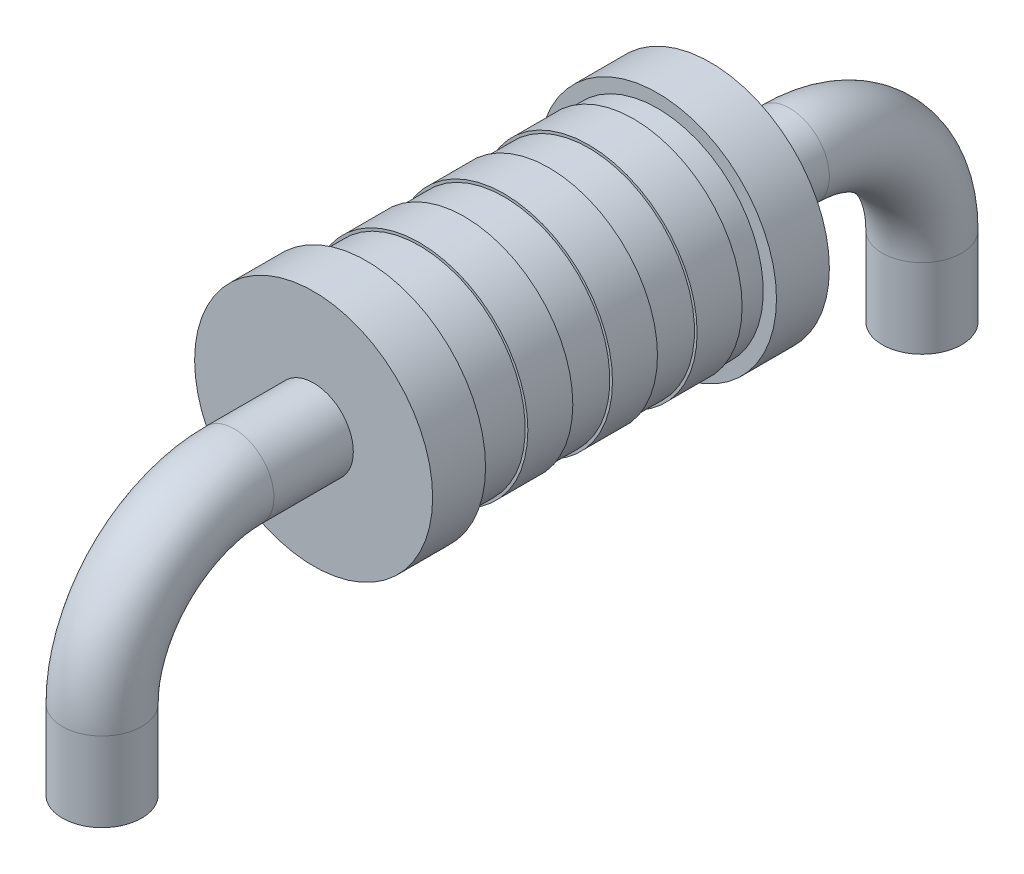
ISO-10303-21;
HEADER;
FILE_DESCRIPTION(('STEP AP214'),'2;1');
FILE_NAME('part.step','',(''),(''),'','','');
FILE_SCHEMA(('AUTOMOTIVE_DESIGN { 1 0 10303 214 1 1 1 1 }'));
ENDSEC;
DATA;
#1=APPLICATION_CONTEXT('core data for automotive mechanical design processes');
#2=APPLICATION_PROTOCOL_DEFINITION('international standard','automotive_design',2000,#1);
#3=PRODUCT_CONTEXT('',#1,'mechanical');
#4=PRODUCT('Part','Part','',(#3));
#5=PRODUCT_RELATED_PRODUCT_CATEGORY('part','',(#4));
#6=PRODUCT_DEFINITION_FORMATION('','',#4);
#7=PRODUCT_DEFINITION_CONTEXT('part definition',#1,'design');
#8=PRODUCT_DEFINITION('design','',#6,#7);
#9=PRODUCT_DEFINITION_SHAPE('','',#8);
#10=(LENGTH_UNIT() NAMED_UNIT(*) SI_UNIT(.MILLI.,.METRE.));
#11=(NAMED_UNIT(*) PLANE_ANGLE_UNIT() SI_UNIT($,.RADIAN.));
#12=(NAMED_UNIT(*) SI_UNIT($,.STERADIAN.) SOLID_ANGLE_UNIT());
#13=UNCERTAINTY_MEASURE_WITH_UNIT(LENGTH_MEASURE(1.E-05),#10,'distance_accuracy_value','');
#14=(GEOMETRIC_REPRESENTATION_CONTEXT(3) GLOBAL_UNCERTAINTY_ASSIGNED_CONTEXT((#13)) GLOBAL_UNIT_ASSIGNED_CONTEXT((#10,
#11,#12)) REPRESENTATION_CONTEXT('',''));
#15=CARTESIAN_POINT('',(0.,0.,0.));
#16=DIRECTION('',(0.,0.,1.));
#17=DIRECTION('',(1.,0.,0.));
#18=AXIS2_PLACEMENT_3D('',#15,#16,#17);
#19=CARTESIAN_POINT('',(0.,0.,0.75));
#20=DIRECTION('',(0.,0.,-1.));
#21=DIRECTION('',(-1.,0.,0.));
#22=AXIS2_PLACEMENT_3D('',#19,#20,#21);
#23=CYLINDRICAL_SURFACE('',#22,0.4);
#24=CARTESIAN_POINT('',(0.,0.,-0.14));
#25=DIRECTION('',(0.,0.,1.));
#26=DIRECTION('',(1.,0.,0.));
#27=AXIS2_PLACEMENT_3D('',#24,#25,#26);
#28=CIRCLE('',#27,0.4);
#29=CARTESIAN_POINT('',(0.4,0.,-0.14));
#30=VERTEX_POINT('',#29);
#31=EDGE_CURVE('E46',#30,#30,#28,.T.);
#32=ORIENTED_EDGE('',*,*,#31,.F.);
#33=EDGE_LOOP('',(#32));
#34=FACE_BOUND('',#33,.T.);
#35=CARTESIAN_POINT('',(0.,0.,-0.29));
#36=DIRECTION('',(0.,0.,-1.));
#37=DIRECTION('',(-1.,0.,0.));
#38=AXIS2_PLACEMENT_3D('',#35,#36,#37);
#39=CIRCLE('',#38,0.4);
#40=CARTESIAN_POINT('',(-0.4,0.,-0.29));
#41=VERTEX_POINT('',#40);
#42=EDGE_CURVE('E10',#41,#41,#39,.T.);
#43=ORIENTED_EDGE('',*,*,#42,.F.);
#44=EDGE_LOOP('',(#43));
#45=FACE_BOUND('',#44,.T.);
#46=ADVANCED_FACE('F31',(#34,#45),#23,.T.);
#47=CARTESIAN_POINT('',(0.,0.,0.18));
#48=DIRECTION('',(0.,0.,1.));
#49=DIRECTION('',(1.,0.,0.));
#50=AXIS2_PLACEMENT_3D('',#47,#48,#49);
#51=CIRCLE('',#50,0.4);
#52=CARTESIAN_POINT('',(0.4,0.,0.18));
#53=VERTEX_POINT('',#52);
#54=EDGE_CURVE('E54',#53,#53,#51,.T.);
#55=ORIENTED_EDGE('',*,*,#54,.F.);
#56=EDGE_LOOP('',(#55));
#57=FACE_BOUND('',#56,.T.);
#58=CARTESIAN_POINT('',(0.,0.,0.0300000000000001));
#59=DIRECTION('',(0.,0.,-1.));
#60=DIRECTION('',(-1.,0.,0.));
#61=AXIS2_PLACEMENT_3D('',#58,#59,#60);
#62=CIRCLE('',#61,0.4);
#63=CARTESIAN_POINT('',(-0.4,0.,0.0300000000000001));
#64=VERTEX_POINT('',#63);
#65=EDGE_CURVE('E42',#64,#64,#62,.T.);
#66=ORIENTED_EDGE('',*,*,#65,.F.);
#67=EDGE_LOOP('',(#66));
#68=FACE_BOUND('',#67,.T.);
#69=ADVANCED_FACE('F135',(#57,#68),#23,.T.);
#70=CARTESIAN_POINT('',(0.,0.,0.55));
#71=DIRECTION('',(0.,0.,1.));
#72=DIRECTION('',(1.,0.,0.));
#73=AXIS2_PLACEMENT_3D('',#70,#71,#72);
#74=CIRCLE('',#73,0.4);
#75=CARTESIAN_POINT('',(0.4,0.,0.55));
#76=VERTEX_POINT('',#75);
#77=EDGE_CURVE('E57',#76,#76,#74,.T.);
#78=ORIENTED_EDGE('',*,*,#77,.F.);
#79=EDGE_LOOP('',(#78));
#80=FACE_BOUND('',#79,.T.);
#81=CARTESIAN_POINT('',(0.,0.,0.35));
#82=DIRECTION('',(0.,0.,-1.));
#83=DIRECTION('',(-1.,0.,0.));
#84=AXIS2_PLACEMENT_3D('',#81,#82,#83);
#85=CIRCLE('',#84,0.4);
#86=CARTESIAN_POINT('',(-0.4,0.,0.35));
#87=VERTEX_POINT('',#86);
#88=EDGE_CURVE('E51',#87,#87,#85,.T.);
#89=ORIENTED_EDGE('',*,*,#88,.F.);
#90=EDGE_LOOP('',(#89));
#91=FACE_BOUND('',#90,.T.);
#92=ADVANCED_FACE('F33',(#80,#91),#23,.T.);
#93=CARTESIAN_POINT('',(0.,0.,0.75));
#94=DIRECTION('',(0.,0.,1.));
#95=DIRECTION('',(1.,0.,0.));
#96=AXIS2_PLACEMENT_3D('',#93,#94,#95);
#97=PLANE('',#96);
#98=CARTESIAN_POINT('',(0.,0.,0.75));
#99=DIRECTION('',(0.,0.,1.));
#100=DIRECTION('',(1.,0.,0.));
#101=AXIS2_PLACEMENT_3D('',#98,#99,#100);
#102=CIRCLE('',#101,0.15);
#103=CARTESIAN_POINT('',(0.15,0.,0.75));
#104=VERTEX_POINT('',#103);
#105=EDGE_CURVE('E66',#104,#104,#102,.T.);
#106=ORIENTED_EDGE('',*,*,#105,.F.);
#107=EDGE_LOOP('',(#106));
#108=FACE_BOUND('',#107,.T.);
#109=CARTESIAN_POINT('',(0.,0.,0.75));
#110=DIRECTION('',(0.,0.,1.));
#111=DIRECTION('',(1.,0.,0.));
#112=AXIS2_PLACEMENT_3D('',#109,#110,#111);
#113=CIRCLE('',#112,0.45);
#114=CARTESIAN_POINT('',(0.45,0.,0.75));
#115=VERTEX_POINT('',#114);
#116=EDGE_CURVE('E85',#115,#115,#113,.T.);
#117=ORIENTED_EDGE('',*,*,#116,.T.);
#118=EDGE_LOOP('',(#117));
#119=FACE_BOUND('',#118,.T.);
#120=ADVANCED_FACE('F148',(#108,#119),#97,.T.);
#121=CARTESIAN_POINT('',(0.,0.,1.05));
#122=DIRECTION('',(0.,0.,-1.));
#123=DIRECTION('',(-1.,0.,0.));
#124=AXIS2_PLACEMENT_3D('',#121,#122,#123);
#125=CYLINDRICAL_SURFACE('',#124,0.15);
#126=CARTESIAN_POINT('',(0.,0.,1.05));
#127=DIRECTION('',(0.,0.,-1.));
#128=DIRECTION('',(0.,1.,0.));
#129=AXIS2_PLACEMENT_3D('',#126,#127,#128);
#130=CIRCLE('',#129,0.15);
#131=CARTESIAN_POINT('',(0.,0.15,1.05));
#132=VERTEX_POINT('',#131);
#133=EDGE_CURVE('E69',#132,#132,#130,.T.);
#134=ORIENTED_EDGE('',*,*,#133,.T.);
#135=EDGE_LOOP('',(#134));
#136=FACE_BOUND('',#135,.T.);
#137=ORIENTED_EDGE('',*,*,#105,.T.);
#138=EDGE_LOOP('',(#137));
#139=FACE_BOUND('',#138,.T.);
#140=ADVANCED_FACE('F153',(#136,#139),#125,.T.);
#141=CARTESIAN_POINT('',(0.,-0.5,1.05));
#142=DIRECTION('',(-1.,0.,0.));
#143=DIRECTION('',(0.,0.,1.));
#144=AXIS2_PLACEMENT_3D('',#141,#142,#143);
#145=TOROIDAL_SURFACE('',#144,0.5,0.15);
#146=CARTESIAN_POINT('',(0.,-0.5,1.55));
#147=DIRECTION('',(0.,1.,0.));
#148=DIRECTION('',(0.,0.,1.));
#149=AXIS2_PLACEMENT_3D('',#146,#147,#148);
#150=CIRCLE('',#149,0.15);
#151=CARTESIAN_POINT('',(0.,-0.5,1.7));
#152=VERTEX_POINT('',#151);
#153=EDGE_CURVE('E72',#152,#152,#150,.T.);
#154=CARTESIAN_POINT('',(0.,-0.5,1.05));
#155=DIRECTION('',(-1.,0.,0.));
#156=DIRECTION('',(0.,0.,1.));
#157=AXIS2_PLACEMENT_3D('',#154,#155,#156);
#158=CIRCLE('',#157,0.65);
#159=EDGE_CURVE('',#152,#132,#158,.T.);
#160=ORIENTED_EDGE('',*,*,#153,.T.);
#161=ORIENTED_EDGE('',*,*,#133,.F.);
#162=ORIENTED_EDGE('',*,*,#159,.T.);
#163=ORIENTED_EDGE('',*,*,#159,.F.);
#164=EDGE_LOOP('',(#160,#162,#161,#163));
#165=FACE_BOUND('',#164,.T.);
#166=ADVANCED_FACE('F211',(#165),#145,.T.);
#167=CARTESIAN_POINT('',(0.,-0.5,1.55));
#168=DIRECTION('',(0.,-1.,0.));
#169=DIRECTION('',(0.,0.,-1.));
#170=AXIS2_PLACEMENT_3D('',#167,#168,#169);
#171=CYLINDRICAL_SURFACE('',#170,0.15);
#172=ORIENTED_EDGE('',*,*,#153,.F.);
#173=EDGE_LOOP('',(#172));
#174=FACE_BOUND('',#173,.T.);
#175=CARTESIAN_POINT('',(0.,-0.8,1.55));
#176=DIRECTION('',(0.,1.,0.));
#177=DIRECTION('',(0.,0.,1.));
#178=AXIS2_PLACEMENT_3D('',#175,#176,#177);
#179=CIRCLE('',#178,0.15);
#180=CARTESIAN_POINT('',(0.,-0.8,1.7));
#181=VERTEX_POINT('',#180);
#182=EDGE_CURVE('E73',#181,#181,#179,.T.);
#183=ORIENTED_EDGE('',*,*,#182,.T.);
#184=EDGE_LOOP('',(#183));
#185=FACE_BOUND('',#184,.T.);
#186=ADVANCED_FACE('F207',(#174,#185),#171,.T.);
#187=CARTESIAN_POINT('',(0.,-0.8,1.55));
#188=DIRECTION('',(0.,1.,0.));
#189=DIRECTION('',(0.,0.,1.));
#190=AXIS2_PLACEMENT_3D('',#187,#188,#189);
#191=PLANE('',#190);
#192=ORIENTED_EDGE('',*,*,#182,.F.);
#193=EDGE_LOOP('',(#192));
#194=FACE_BOUND('',#193,.T.);
#195=ADVANCED_FACE('F188',(#194),#191,.F.);
#196=CARTESIAN_POINT('',(0.,0.,1.95300630121918));
#197=DIRECTION('',(0.,0.,1.));
#198=DIRECTION('',(1.,0.,0.));
#199=AXIS2_PLACEMENT_3D('',#196,#197,#198);
#200=CYLINDRICAL_SURFACE('',#199,0.45);
#201=ORIENTED_EDGE('',*,*,#116,.F.);
#202=EDGE_LOOP('',(#201));
#203=FACE_BOUND('',#202,.T.);
#204=CARTESIAN_POINT('',(0.,0.,0.55));
#205=DIRECTION('',(0.,0.,1.));
#206=DIRECTION('',(1.,0.,0.));
#207=AXIS2_PLACEMENT_3D('',#204,#205,#206);
#208=CIRCLE('',#207,0.45);
#209=CARTESIAN_POINT('',(0.45,0.,0.55));
#210=VERTEX_POINT('',#209);
#211=EDGE_CURVE('E90',#210,#210,#208,.T.);
#212=ORIENTED_EDGE('',*,*,#211,.T.);
#213=EDGE_LOOP('',(#212));
#214=FACE_BOUND('',#213,.T.);
#215=ADVANCED_FACE('F173',(#203,#214),#200,.T.);
#216=CARTESIAN_POINT('',(0.,0.45,0.55));
#217=DIRECTION('',(0.,0.,1.));
#218=DIRECTION('',(1.,0.,0.));
#219=AXIS2_PLACEMENT_3D('',#216,#217,#218);
#220=PLANE('',#219);
#221=ORIENTED_EDGE('',*,*,#211,.F.);
#222=EDGE_LOOP('',(#221));
#223=FACE_BOUND('',#222,.T.);
#224=ORIENTED_EDGE('',*,*,#77,.T.);
#225=EDGE_LOOP('',(#224));
#226=FACE_BOUND('',#225,.T.);
#227=ADVANCED_FACE('F163',(#223,#226),#220,.F.);
#228=CARTESIAN_POINT('',(0.,0.,0.35));
#229=DIRECTION('',(0.,0.,-1.));
#230=DIRECTION('',(-1.,0.,0.));
#231=AXIS2_PLACEMENT_3D('',#228,#229,#230);
#232=PLANE('',#231);
#233=CARTESIAN_POINT('',(0.,0.,0.35));
#234=DIRECTION('',(0.,0.,1.));
#235=DIRECTION('',(1.,0.,0.));
#236=AXIS2_PLACEMENT_3D('',#233,#234,#235);
#237=CIRCLE('',#236,0.41);
#238=CARTESIAN_POINT('',(0.41,0.,0.35));
#239=VERTEX_POINT('',#238);
#240=EDGE_CURVE('E99',#239,#239,#237,.T.);
#241=ORIENTED_EDGE('',*,*,#240,.T.);
#242=EDGE_LOOP('',(#241));
#243=FACE_BOUND('',#242,.T.);
#244=ORIENTED_EDGE('',*,*,#88,.T.);
#245=EDGE_LOOP('',(#244));
#246=FACE_BOUND('',#245,.T.);
#247=ADVANCED_FACE('F160',(#243,#246),#232,.F.);
#248=CARTESIAN_POINT('',(0.,0.41,0.18));
#249=DIRECTION('',(0.,0.,1.));
#250=DIRECTION('',(1.,0.,0.));
#251=AXIS2_PLACEMENT_3D('',#248,#249,#250);
#252=PLANE('',#251);
#253=CARTESIAN_POINT('',(0.,0.,0.18));
#254=DIRECTION('',(0.,0.,1.));
#255=DIRECTION('',(1.,0.,0.));
#256=AXIS2_PLACEMENT_3D('',#253,#254,#255);
#257=CIRCLE('',#256,0.41);
#258=CARTESIAN_POINT('',(0.41,0.,0.18));
#259=VERTEX_POINT('',#258);
#260=EDGE_CURVE('E102',#259,#259,#257,.T.);
#261=ORIENTED_EDGE('',*,*,#260,.F.);
#262=EDGE_LOOP('',(#261));
#263=FACE_BOUND('',#262,.T.);
#264=ORIENTED_EDGE('',*,*,#54,.T.);
#265=EDGE_LOOP('',(#264));
#266=FACE_BOUND('',#265,.T.);
#267=ADVANCED_FACE('F162',(#263,#266),#252,.F.);
#268=CARTESIAN_POINT('',(0.,0.,1.91555138585334));
#269=DIRECTION('',(0.,0.,1.));
#270=DIRECTION('',(1.,0.,0.));
#271=AXIS2_PLACEMENT_3D('',#268,#269,#270);
#272=CYLINDRICAL_SURFACE('',#271,0.41);
#273=ORIENTED_EDGE('',*,*,#240,.F.);
#274=EDGE_LOOP('',(#273));
#275=FACE_BOUND('',#274,.T.);
#276=ORIENTED_EDGE('',*,*,#260,.T.);
#277=EDGE_LOOP('',(#276));
#278=FACE_BOUND('',#277,.T.);
#279=ADVANCED_FACE('F170',(#275,#278),#272,.T.);
#280=CARTESIAN_POINT('',(0.,0.,0.0300000000000001));
#281=DIRECTION('',(0.,0.,-1.));
#282=DIRECTION('',(-1.,0.,0.));
#283=AXIS2_PLACEMENT_3D('',#280,#281,#282);
#284=PLANE('',#283);
#285=CARTESIAN_POINT('',(0.,0.,0.0300000000000001));
#286=DIRECTION('',(0.,0.,1.));
#287=DIRECTION('',(1.,0.,0.));
#288=AXIS2_PLACEMENT_3D('',#285,#286,#287);
#289=CIRCLE('',#288,0.41);
#290=CARTESIAN_POINT('',(0.41,0.,0.0300000000000001));
#291=VERTEX_POINT('',#290);
#292=EDGE_CURVE('E105',#291,#291,#289,.T.);
#293=ORIENTED_EDGE('',*,*,#292,.T.);
#294=EDGE_LOOP('',(#293));
#295=FACE_BOUND('',#294,.T.);
#296=ORIENTED_EDGE('',*,*,#65,.T.);
#297=EDGE_LOOP('',(#296));
#298=FACE_BOUND('',#297,.T.);
#299=ADVANCED_FACE('F281',(#295,#298),#284,.F.);
#300=CARTESIAN_POINT('',(0.,0.41,-0.14));
#301=DIRECTION('',(0.,0.,1.));
#302=DIRECTION('',(1.,0.,0.));
#303=AXIS2_PLACEMENT_3D('',#300,#301,#302);
#304=PLANE('',#303);
#305=CARTESIAN_POINT('',(0.,0.,-0.14));
#306=DIRECTION('',(0.,0.,1.));
#307=DIRECTION('',(1.,0.,0.));
#308=AXIS2_PLACEMENT_3D('',#305,#306,#307);
#309=CIRCLE('',#308,0.41);
#310=CARTESIAN_POINT('',(0.41,0.,-0.14));
#311=VERTEX_POINT('',#310);
#312=EDGE_CURVE('E108',#311,#311,#309,.T.);
#313=ORIENTED_EDGE('',*,*,#312,.F.);
#314=EDGE_LOOP('',(#313));
#315=FACE_BOUND('',#314,.T.);
#316=ORIENTED_EDGE('',*,*,#31,.T.);
#317=EDGE_LOOP('',(#316));
#318=FACE_BOUND('',#317,.T.);
#319=ADVANCED_FACE('F271',(#315,#318),#304,.F.);
#320=CARTESIAN_POINT('',(0.,0.,1.83995008530708));
#321=DIRECTION('',(0.,0.,1.));
#322=DIRECTION('',(1.,0.,0.));
#323=AXIS2_PLACEMENT_3D('',#320,#321,#322);
#324=CYLINDRICAL_SURFACE('',#323,0.41);
#325=ORIENTED_EDGE('',*,*,#292,.F.);
#326=EDGE_LOOP('',(#325));
#327=FACE_BOUND('',#326,.T.);
#328=ORIENTED_EDGE('',*,*,#312,.T.);
#329=EDGE_LOOP('',(#328));
#330=FACE_BOUND('',#329,.T.);
#331=ADVANCED_FACE('F131',(#327,#330),#324,.T.);
#332=CARTESIAN_POINT('',(0.,0.,-0.29));
#333=DIRECTION('',(0.,0.,-1.));
#334=DIRECTION('',(-1.,0.,0.));
#335=AXIS2_PLACEMENT_3D('',#332,#333,#334);
#336=PLANE('',#335);
#337=CARTESIAN_POINT('',(0.,0.,-0.29));
#338=DIRECTION('',(0.,0.,1.));
#339=DIRECTION('',(1.,0.,0.));
#340=AXIS2_PLACEMENT_3D('',#337,#338,#339);
#341=CIRCLE('',#340,0.41);
#342=CARTESIAN_POINT('',(0.41,0.,-0.29));
#343=VERTEX_POINT('',#342);
#344=EDGE_CURVE('E111',#343,#343,#341,.T.);
#345=ORIENTED_EDGE('',*,*,#344,.T.);
#346=EDGE_LOOP('',(#345));
#347=FACE_BOUND('',#346,.T.);
#348=ORIENTED_EDGE('',*,*,#42,.T.);
#349=EDGE_LOOP('',(#348));
#350=FACE_BOUND('',#349,.T.);
#351=ADVANCED_FACE('F122',(#347,#350),#336,.F.);
#352=CARTESIAN_POINT('',(0.,0.41,-0.46));
#353=DIRECTION('',(0.,0.,1.));
#354=DIRECTION('',(1.,0.,0.));
#355=AXIS2_PLACEMENT_3D('',#352,#353,#354);
#356=PLANE('',#355);
#357=CARTESIAN_POINT('',(0.,0.,-0.46));
#358=DIRECTION('',(0.,0.,1.));
#359=DIRECTION('',(1.,0.,0.));
#360=AXIS2_PLACEMENT_3D('',#357,#358,#359);
#361=CIRCLE('',#360,0.41);
#362=CARTESIAN_POINT('',(0.41,0.,-0.46));
#363=VERTEX_POINT('',#362);
#364=EDGE_CURVE('E114',#363,#363,#361,.T.);
#365=ORIENTED_EDGE('',*,*,#364,.F.);
#366=EDGE_LOOP('',(#365));
#367=FACE_BOUND('',#366,.T.);
#368=CARTESIAN_POINT('',(0.,0.,-0.46));
#369=DIRECTION('',(0.,0.,1.));
#370=DIRECTION('',(1.,0.,0.));
#371=AXIS2_PLACEMENT_3D('',#368,#369,#370);
#372=CIRCLE('',#371,0.4);
#373=CARTESIAN_POINT('',(0.4,0.,-0.46));
#374=VERTEX_POINT('',#373);
#375=EDGE_CURVE('E38',#374,#374,#372,.T.);
#376=ORIENTED_EDGE('',*,*,#375,.T.);
#377=EDGE_LOOP('',(#376));
#378=FACE_BOUND('',#377,.T.);
#379=ADVANCED_FACE('F120',(#367,#378),#356,.F.);
#380=CARTESIAN_POINT('',(0.,0.,1.85428393323629));
#381=DIRECTION('',(0.,0.,1.));
#382=DIRECTION('',(1.,0.,0.));
#383=AXIS2_PLACEMENT_3D('',#380,#381,#382);
#384=CYLINDRICAL_SURFACE('',#383,0.41);
#385=ORIENTED_EDGE('',*,*,#344,.F.);
#386=EDGE_LOOP('',(#385));
#387=FACE_BOUND('',#386,.T.);
#388=ORIENTED_EDGE('',*,*,#364,.T.);
#389=EDGE_LOOP('',(#388));
#390=FACE_BOUND('',#389,.T.);
#391=ADVANCED_FACE('F118',(#387,#390),#384,.T.);
#392=CARTESIAN_POINT('',(0.,-0.8,-1.55));
#393=DIRECTION('',(0.,1.,0.));
#394=DIRECTION('',(0.,0.,-1.));
#395=AXIS2_PLACEMENT_3D('',#392,#393,#394);
#396=PLANE('',#395);
#397=CARTESIAN_POINT('',(0.,-0.8,-1.55));
#398=DIRECTION('',(0.,-1.,0.));
#399=DIRECTION('',(0.,0.,-1.));
#400=AXIS2_PLACEMENT_3D('',#397,#398,#399);
#401=CIRCLE('',#400,0.15);
#402=CARTESIAN_POINT('',(0.,-0.8,-1.7));
#403=VERTEX_POINT('',#402);
#404=EDGE_CURVE('E82',#403,#403,#401,.T.);
#405=ORIENTED_EDGE('',*,*,#404,.T.);
#406=EDGE_LOOP('',(#405));
#407=FACE_BOUND('',#406,.T.);
#408=ADVANCED_FACE('F128',(#407),#396,.F.);
#409=CARTESIAN_POINT('',(0.,-0.5,-1.55));
#410=DIRECTION('',(0.,-1.,0.));
#411=DIRECTION('',(0.,0.,-1.));
#412=AXIS2_PLACEMENT_3D('',#409,#410,#411);
#413=CYLINDRICAL_SURFACE('',#412,0.15);
#414=CARTESIAN_POINT('',(0.,-0.5,-1.55));
#415=DIRECTION('',(0.,-1.,0.));
#416=DIRECTION('',(0.,0.,-1.));
#417=AXIS2_PLACEMENT_3D('',#414,#415,#416);
#418=CIRCLE('',#417,0.15);
#419=CARTESIAN_POINT('',(0.,-0.5,-1.7));
#420=VERTEX_POINT('',#419);
#421=EDGE_CURVE('E81',#420,#420,#418,.T.);
#422=ORIENTED_EDGE('',*,*,#421,.T.);
#423=EDGE_LOOP('',(#422));
#424=FACE_BOUND('',#423,.T.);
#425=ORIENTED_EDGE('',*,*,#404,.F.);
#426=EDGE_LOOP('',(#425));
#427=FACE_BOUND('',#426,.T.);
#428=ADVANCED_FACE('F192',(#424,#427),#413,.T.);
#429=CARTESIAN_POINT('',(0.,-0.5,-1.05));
#430=DIRECTION('',(1.,0.,0.));
#431=DIRECTION('',(0.,0.,-1.));
#432=AXIS2_PLACEMENT_3D('',#429,#430,#431);
#433=TOROIDAL_SURFACE('',#432,0.5,0.15);
#434=CARTESIAN_POINT('',(0.,0.,-1.05));
#435=DIRECTION('',(0.,0.,-1.));
#436=DIRECTION('',(0.,1.,0.));
#437=AXIS2_PLACEMENT_3D('',#434,#435,#436);
#438=CIRCLE('',#437,0.15);
#439=CARTESIAN_POINT('',(0.,0.15,-1.05));
#440=VERTEX_POINT('',#439);
#441=EDGE_CURVE('E76',#440,#440,#438,.T.);
#442=CARTESIAN_POINT('',(0.,-0.5,-1.05));
#443=DIRECTION('',(1.,0.,0.));
#444=DIRECTION('',(0.,0.,-1.));
#445=AXIS2_PLACEMENT_3D('',#442,#443,#444);
#446=CIRCLE('',#445,0.65);
#447=EDGE_CURVE('',#420,#440,#446,.T.);
#448=ORIENTED_EDGE('',*,*,#421,.F.);
#449=ORIENTED_EDGE('',*,*,#441,.T.);
#450=ORIENTED_EDGE('',*,*,#447,.T.);
#451=ORIENTED_EDGE('',*,*,#447,.F.);
#452=EDGE_LOOP('',(#448,#450,#449,#451));
#453=FACE_BOUND('',#452,.T.);
#454=ADVANCED_FACE('F196',(#453),#433,.T.);
#455=CARTESIAN_POINT('',(0.,0.,-1.05));
#456=DIRECTION('',(0.,0.,1.));
#457=DIRECTION('',(1.,0.,0.));
#458=AXIS2_PLACEMENT_3D('',#455,#456,#457);
#459=CYLINDRICAL_SURFACE('',#458,0.15);
#460=ORIENTED_EDGE('',*,*,#441,.F.);
#461=EDGE_LOOP('',(#460));
#462=FACE_BOUND('',#461,.T.);
#463=CARTESIAN_POINT('',(0.,0.,-0.75));
#464=DIRECTION('',(0.,0.,1.));
#465=DIRECTION('',(1.,0.,0.));
#466=AXIS2_PLACEMENT_3D('',#463,#464,#465);
#467=CIRCLE('',#466,0.15);
#468=CARTESIAN_POINT('',(0.15,0.,-0.75));
#469=VERTEX_POINT('',#468);
#470=EDGE_CURVE('E63',#469,#469,#467,.F.);
#471=ORIENTED_EDGE('',*,*,#470,.T.);
#472=EDGE_LOOP('',(#471));
#473=FACE_BOUND('',#472,.T.);
#474=ADVANCED_FACE('F200',(#462,#473),#459,.T.);
#475=CARTESIAN_POINT('',(0.,0.,-0.75));
#476=DIRECTION('',(0.,0.,1.));
#477=DIRECTION('',(1.,0.,0.));
#478=AXIS2_PLACEMENT_3D('',#475,#476,#477);
#479=PLANE('',#478);
#480=ORIENTED_EDGE('',*,*,#470,.F.);
#481=EDGE_LOOP('',(#480));
#482=FACE_BOUND('',#481,.T.);
#483=CARTESIAN_POINT('',(0.,0.,-0.75));
#484=DIRECTION('',(0.,0.,1.));
#485=DIRECTION('',(1.,0.,0.));
#486=AXIS2_PLACEMENT_3D('',#483,#484,#485);
#487=CIRCLE('',#486,0.45);
#488=CARTESIAN_POINT('',(0.45,0.,-0.75));
#489=VERTEX_POINT('',#488);
#490=EDGE_CURVE('E96',#489,#489,#487,.T.);
#491=ORIENTED_EDGE('',*,*,#490,.F.);
#492=EDGE_LOOP('',(#491));
#493=FACE_BOUND('',#492,.T.);
#494=ADVANCED_FACE('F181',(#482,#493),#479,.F.);
#495=CARTESIAN_POINT('',(0.,0.,1.95300630121918));
#496=DIRECTION('',(0.,0.,1.));
#497=DIRECTION('',(1.,0.,0.));
#498=AXIS2_PLACEMENT_3D('',#495,#496,#497);
#499=CYLINDRICAL_SURFACE('',#498,0.45);
#500=CARTESIAN_POINT('',(0.,0.,-0.55));
#501=DIRECTION('',(0.,0.,1.));
#502=DIRECTION('',(1.,0.,0.));
#503=AXIS2_PLACEMENT_3D('',#500,#501,#502);
#504=CIRCLE('',#503,0.45);
#505=CARTESIAN_POINT('',(0.45,0.,-0.55));
#506=VERTEX_POINT('',#505);
#507=EDGE_CURVE('E93',#506,#506,#504,.T.);
#508=ORIENTED_EDGE('',*,*,#507,.F.);
#509=EDGE_LOOP('',(#508));
#510=FACE_BOUND('',#509,.T.);
#511=ORIENTED_EDGE('',*,*,#490,.T.);
#512=EDGE_LOOP('',(#511));
#513=FACE_BOUND('',#512,.T.);
#514=ADVANCED_FACE('F178',(#510,#513),#499,.T.);
#515=CARTESIAN_POINT('',(0.,0.4,-0.55));
#516=DIRECTION('',(0.,0.,-1.));
#517=DIRECTION('',(-1.,0.,0.));
#518=AXIS2_PLACEMENT_3D('',#515,#516,#517);
#519=PLANE('',#518);
#520=CARTESIAN_POINT('',(0.,0.,-0.55));
#521=DIRECTION('',(0.,0.,-1.));
#522=DIRECTION('',(-1.,0.,0.));
#523=AXIS2_PLACEMENT_3D('',#520,#521,#522);
#524=CIRCLE('',#523,0.4);
#525=CARTESIAN_POINT('',(-0.4,0.,-0.55));
#526=VERTEX_POINT('',#525);
#527=EDGE_CURVE('E60',#526,#526,#524,.T.);
#528=ORIENTED_EDGE('',*,*,#527,.T.);
#529=EDGE_LOOP('',(#528));
#530=FACE_BOUND('',#529,.T.);
#531=ORIENTED_EDGE('',*,*,#507,.T.);
#532=EDGE_LOOP('',(#531));
#533=FACE_BOUND('',#532,.T.);
#534=ADVANCED_FACE('F145',(#530,#533),#519,.F.);
#535=ORIENTED_EDGE('',*,*,#527,.F.);
#536=EDGE_LOOP('',(#535));
#537=FACE_BOUND('',#536,.T.);
#538=ORIENTED_EDGE('',*,*,#375,.F.);
#539=EDGE_LOOP('',(#538));
#540=FACE_BOUND('',#539,.T.);
#541=ADVANCED_FACE('F137',(#537,#540),#23,.T.);
#542=CLOSED_SHELL('',(#46,#69,#92,#120,#140,#166,#186,#195,#215,#227,#247,#267,#279,#299,#319,
#331,#351,#379,#391,#408,#428,#454,#474,#494,#514,#534,#541));
#543=MANIFOLD_SOLID_BREP('B2',#542);
#544=ADVANCED_BREP_SHAPE_REPRESENTATION('',(#18,#543),#14);
#545=SHAPE_DEFINITION_REPRESENTATION(#9,#544);
ENDSEC;
END-ISO-10303-21;
